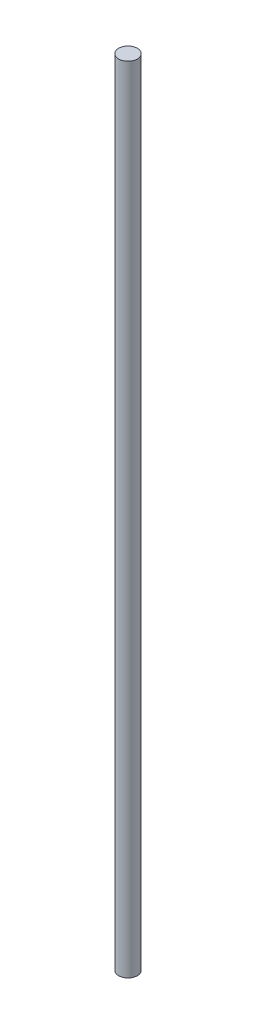
ISO-10303-21;
HEADER;
FILE_DESCRIPTION(('STEP AP214'),'2;1');
FILE_NAME('part.step','',(''),(''),'','','');
FILE_SCHEMA(('AUTOMOTIVE_DESIGN { 1 0 10303 214 1 1 1 1 }'));
ENDSEC;
DATA;
#1=APPLICATION_CONTEXT('core data for automotive mechanical design processes');
#2=APPLICATION_PROTOCOL_DEFINITION('international standard','automotive_design',2000,#1);
#3=PRODUCT_CONTEXT('',#1,'mechanical');
#4=PRODUCT('Part','Part','',(#3));
#5=PRODUCT_RELATED_PRODUCT_CATEGORY('part','',(#4));
#6=PRODUCT_DEFINITION_FORMATION('','',#4);
#7=PRODUCT_DEFINITION_CONTEXT('part definition',#1,'design');
#8=PRODUCT_DEFINITION('design','',#6,#7);
#9=PRODUCT_DEFINITION_SHAPE('','',#8);
#10=(LENGTH_UNIT() NAMED_UNIT(*) SI_UNIT(.MILLI.,.METRE.));
#11=(NAMED_UNIT(*) PLANE_ANGLE_UNIT() SI_UNIT($,.RADIAN.));
#12=(NAMED_UNIT(*) SI_UNIT($,.STERADIAN.) SOLID_ANGLE_UNIT());
#13=UNCERTAINTY_MEASURE_WITH_UNIT(LENGTH_MEASURE(1.E-05),#10,'distance_accuracy_value','');
#14=(GEOMETRIC_REPRESENTATION_CONTEXT(3) GLOBAL_UNCERTAINTY_ASSIGNED_CONTEXT((#13)) GLOBAL_UNIT_ASSIGNED_CONTEXT((#10,
#11,#12)) REPRESENTATION_CONTEXT('',''));
#15=CARTESIAN_POINT('',(0.,0.,0.));
#16=DIRECTION('',(0.,0.,1.));
#17=DIRECTION('',(1.,0.,0.));
#18=AXIS2_PLACEMENT_3D('',#15,#16,#17);
#19=CARTESIAN_POINT('',(0.,340.,0.));
#20=DIRECTION('',(0.,-1.,0.));
#21=DIRECTION('',(0.,0.,-1.));
#22=AXIS2_PLACEMENT_3D('',#19,#20,#21);
#23=CYLINDRICAL_SURFACE('',#22,4.);
#24=CARTESIAN_POINT('',(0.,340.,0.));
#25=DIRECTION('',(0.,1.,0.));
#26=DIRECTION('',(0.,0.,1.));
#27=AXIS2_PLACEMENT_3D('',#24,#25,#26);
#28=CIRCLE('',#27,4.);
#29=CARTESIAN_POINT('',(0.,340.,4.));
#30=VERTEX_POINT('',#29);
#31=EDGE_CURVE('E10',#30,#30,#28,.T.);
#32=ORIENTED_EDGE('',*,*,#31,.F.);
#33=EDGE_LOOP('',(#32));
#34=FACE_BOUND('',#33,.T.);
#35=CARTESIAN_POINT('',(0.,0.,0.));
#36=DIRECTION('',(0.,1.,0.));
#37=DIRECTION('',(0.,0.,1.));
#38=AXIS2_PLACEMENT_3D('',#35,#36,#37);
#39=CIRCLE('',#38,4.);
#40=CARTESIAN_POINT('',(0.,0.,4.));
#41=VERTEX_POINT('',#40);
#42=EDGE_CURVE('E35',#41,#41,#39,.T.);
#43=ORIENTED_EDGE('',*,*,#42,.T.);
#44=EDGE_LOOP('',(#43));
#45=FACE_BOUND('',#44,.T.);
#46=ADVANCED_FACE('F32',(#34,#45),#23,.T.);
#47=CARTESIAN_POINT('',(0.,340.,0.));
#48=DIRECTION('',(0.,1.,0.));
#49=DIRECTION('',(0.,0.,1.));
#50=AXIS2_PLACEMENT_3D('',#47,#48,#49);
#51=PLANE('',#50);
#52=ORIENTED_EDGE('',*,*,#31,.T.);
#53=EDGE_LOOP('',(#52));
#54=FACE_BOUND('',#53,.T.);
#55=ADVANCED_FACE('F47',(#54),#51,.T.);
#56=CARTESIAN_POINT('',(0.,0.,0.));
#57=DIRECTION('',(0.,1.,0.));
#58=DIRECTION('',(0.,0.,1.));
#59=AXIS2_PLACEMENT_3D('',#56,#57,#58);
#60=PLANE('',#59);
#61=ORIENTED_EDGE('',*,*,#42,.F.);
#62=EDGE_LOOP('',(#61));
#63=FACE_BOUND('',#62,.T.);
#64=ADVANCED_FACE('F45',(#63),#60,.F.);
#65=CLOSED_SHELL('',(#46,#55,#64));
#66=MANIFOLD_SOLID_BREP('B2',#65);
#67=ADVANCED_BREP_SHAPE_REPRESENTATION('',(#18,#66),#14);
#68=SHAPE_DEFINITION_REPRESENTATION(#9,#67);
ENDSEC;
END-ISO-10303-21;
